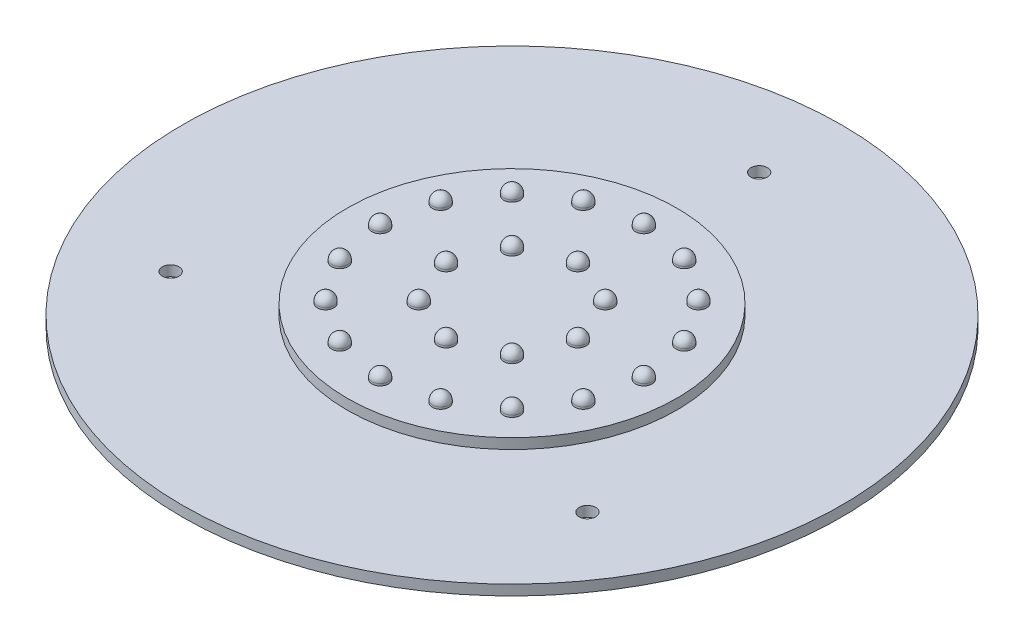
ISO-10303-21;
HEADER;
FILE_DESCRIPTION(('STEP AP214'),'2;1');
FILE_NAME('part.step','',(''),(''),'','','');
FILE_SCHEMA(('AUTOMOTIVE_DESIGN { 1 0 10303 214 1 1 1 1 }'));
ENDSEC;
DATA;
#1=APPLICATION_CONTEXT('core data for automotive mechanical design processes');
#2=APPLICATION_PROTOCOL_DEFINITION('international standard','automotive_design',2000,#1);
#3=PRODUCT_CONTEXT('',#1,'mechanical');
#4=PRODUCT('Part','Part','',(#3));
#5=PRODUCT_RELATED_PRODUCT_CATEGORY('part','',(#4));
#6=PRODUCT_DEFINITION_FORMATION('','',#4);
#7=PRODUCT_DEFINITION_CONTEXT('part definition',#1,'design');
#8=PRODUCT_DEFINITION('design','',#6,#7);
#9=PRODUCT_DEFINITION_SHAPE('','',#8);
#10=(LENGTH_UNIT() NAMED_UNIT(*) SI_UNIT(.MILLI.,.METRE.));
#11=(NAMED_UNIT(*) PLANE_ANGLE_UNIT() SI_UNIT($,.RADIAN.));
#12=(NAMED_UNIT(*) SI_UNIT($,.STERADIAN.) SOLID_ANGLE_UNIT());
#13=UNCERTAINTY_MEASURE_WITH_UNIT(LENGTH_MEASURE(1.E-05),#10,'distance_accuracy_value','');
#14=(GEOMETRIC_REPRESENTATION_CONTEXT(3) GLOBAL_UNCERTAINTY_ASSIGNED_CONTEXT((#13)) GLOBAL_UNIT_ASSIGNED_CONTEXT((#10,
#11,#12)) REPRESENTATION_CONTEXT('',''));
#15=CARTESIAN_POINT('',(0.,0.,0.));
#16=DIRECTION('',(0.,0.,1.));
#17=DIRECTION('',(1.,0.,0.));
#18=AXIS2_PLACEMENT_3D('',#15,#16,#17);
#19=CARTESIAN_POINT('',(0.,5.,0.));
#20=DIRECTION('',(0.,-1.,0.));
#21=DIRECTION('',(0.,0.,-1.));
#22=AXIS2_PLACEMENT_3D('',#19,#20,#21);
#23=CYLINDRICAL_SURFACE('',#22,80.);
#24=CARTESIAN_POINT('',(0.,5.,0.));
#25=DIRECTION('',(0.,1.,0.));
#26=DIRECTION('',(0.,0.,1.));
#27=AXIS2_PLACEMENT_3D('',#24,#25,#26);
#28=CIRCLE('',#27,80.);
#29=CARTESIAN_POINT('',(0.,5.,80.));
#30=VERTEX_POINT('',#29);
#31=EDGE_CURVE('E116',#30,#30,#28,.T.);
#32=ORIENTED_EDGE('',*,*,#31,.F.);
#33=EDGE_LOOP('',(#32));
#34=FACE_BOUND('',#33,.T.);
#35=CARTESIAN_POINT('',(0.,0.,0.));
#36=DIRECTION('',(0.,1.,0.));
#37=DIRECTION('',(0.,0.,1.));
#38=AXIS2_PLACEMENT_3D('',#35,#36,#37);
#39=CIRCLE('',#38,80.);
#40=CARTESIAN_POINT('',(0.,0.,80.));
#41=VERTEX_POINT('',#40);
#42=EDGE_CURVE('E117',#41,#41,#39,.T.);
#43=ORIENTED_EDGE('',*,*,#42,.T.);
#44=EDGE_LOOP('',(#43));
#45=FACE_BOUND('',#44,.T.);
#46=ADVANCED_FACE('F36',(#34,#45),#23,.T.);
#47=CARTESIAN_POINT('',(0.,5.,0.));
#48=DIRECTION('',(0.,1.,0.));
#49=DIRECTION('',(0.,0.,1.));
#50=AXIS2_PLACEMENT_3D('',#47,#48,#49);
#51=PLANE('',#50);
#52=CARTESIAN_POINT('',(-22.6274169979687,5.,-22.6274169979676));
#53=DIRECTION('',(0.,1.,0.));
#54=DIRECTION('',(0.,0.,1.));
#55=AXIS2_PLACEMENT_3D('',#52,#53,#54);
#56=CIRCLE('',#55,4.00000000000171);
#57=CARTESIAN_POINT('',(-22.6274169979687,5.,-18.6274169979659));
#58=VERTEX_POINT('',#57);
#59=EDGE_CURVE('E215',#58,#58,#56,.T.);
#60=ORIENTED_EDGE('',*,*,#59,.F.);
#61=EDGE_LOOP('',(#60));
#62=FACE_BOUND('',#61,.T.);
#63=CARTESIAN_POINT('',(-31.9999999999973,5.,2.72652467044015E-12));
#64=DIRECTION('',(0.,1.,0.));
#65=DIRECTION('',(0.,0.,1.));
#66=AXIS2_PLACEMENT_3D('',#63,#64,#65);
#67=CIRCLE('',#66,4.00000000000372);
#68=CARTESIAN_POINT('',(-31.9999999999973,5.,4.00000000000645));
#69=VERTEX_POINT('',#68);
#70=EDGE_CURVE('E212',#69,#69,#67,.T.);
#71=ORIENTED_EDGE('',*,*,#70,.F.);
#72=EDGE_LOOP('',(#71));
#73=FACE_BOUND('',#72,.T.);
#74=CARTESIAN_POINT('',(-22.6274169979649,5.,22.6274169979714));
#75=DIRECTION('',(0.,1.,0.));
#76=DIRECTION('',(0.,0.,1.));
#77=AXIS2_PLACEMENT_3D('',#74,#75,#76);
#78=CIRCLE('',#77,4.00000000000528);
#79=CARTESIAN_POINT('',(-22.6274169979649,5.,26.6274169979767));
#80=VERTEX_POINT('',#79);
#81=EDGE_CURVE('E209',#80,#80,#78,.T.);
#82=ORIENTED_EDGE('',*,*,#81,.F.);
#83=EDGE_LOOP('',(#82));
#84=FACE_BOUND('',#83,.T.);
#85=CARTESIAN_POINT('',(5.44521160136576E-12,5.,32.));
#86=DIRECTION('',(0.,1.,0.));
#87=DIRECTION('',(0.,0.,1.));
#88=AXIS2_PLACEMENT_3D('',#85,#86,#87);
#89=CIRCLE('',#88,4.00000000000542);
#90=CARTESIAN_POINT('',(5.44521160136576E-12,5.,36.0000000000054));
#91=VERTEX_POINT('',#90);
#92=EDGE_CURVE('E206',#91,#91,#89,.T.);
#93=ORIENTED_EDGE('',*,*,#92,.F.);
#94=EDGE_LOOP('',(#93));
#95=FACE_BOUND('',#94,.T.);
#96=CARTESIAN_POINT('',(22.6274169979742,5.,22.6274169979676));
#97=DIRECTION('',(0.,1.,0.));
#98=DIRECTION('',(0.,0.,1.));
#99=AXIS2_PLACEMENT_3D('',#96,#97,#98);
#100=CIRCLE('',#99,4.00000000000404);
#101=CARTESIAN_POINT('',(22.6274169979742,5.,26.6274169979716));
#102=VERTEX_POINT('',#101);
#103=EDGE_CURVE('E203',#102,#102,#100,.T.);
#104=ORIENTED_EDGE('',*,*,#103,.F.);
#105=EDGE_LOOP('',(#104));
#106=FACE_BOUND('',#105,.T.);
#107=CARTESIAN_POINT('',(32.0000000000027,5.,-2.72260580068288E-12));
#108=DIRECTION('',(0.,1.,0.));
#109=DIRECTION('',(0.,0.,1.));
#110=AXIS2_PLACEMENT_3D('',#107,#108,#109);
#111=CIRCLE('',#110,4.00000000000192);
#112=CARTESIAN_POINT('',(32.0000000000027,5.,3.99999999999919));
#113=VERTEX_POINT('',#112);
#114=EDGE_CURVE('E200',#113,#113,#111,.T.);
#115=ORIENTED_EDGE('',*,*,#114,.F.);
#116=EDGE_LOOP('',(#115));
#117=FACE_BOUND('',#116,.T.);
#118=CARTESIAN_POINT('',(22.6274169979703,5.,-22.6274169979714));
#119=DIRECTION('',(0.,1.,0.));
#120=DIRECTION('',(0.,0.,1.));
#121=AXIS2_PLACEMENT_3D('',#118,#119,#120);
#122=CIRCLE('',#121,4.00000000000026);
#123=CARTESIAN_POINT('',(22.6274169979703,5.,-18.6274169979712));
#124=VERTEX_POINT('',#123);
#125=EDGE_CURVE('E197',#124,#124,#122,.T.);
#126=ORIENTED_EDGE('',*,*,#125,.F.);
#127=EDGE_LOOP('',(#126));
#128=FACE_BOUND('',#127,.T.);
#129=CARTESIAN_POINT('',(0.,5.,-32.));
#130=DIRECTION('',(0.,1.,0.));
#131=DIRECTION('',(0.,0.,1.));
#132=AXIS2_PLACEMENT_3D('',#129,#130,#131);
#133=CIRCLE('',#132,4.);
#134=CARTESIAN_POINT('',(0.,5.,-28.));
#135=VERTEX_POINT('',#134);
#136=EDGE_CURVE('E194',#135,#135,#133,.T.);
#137=ORIENTED_EDGE('',*,*,#136,.F.);
#138=EDGE_LOOP('',(#137));
#139=FACE_BOUND('',#138,.T.);
#140=CARTESIAN_POINT('',(-24.4917396713648,5.,-59.1282900807175));
#141=DIRECTION('',(0.,1.,0.));
#142=DIRECTION('',(0.,0.,1.));
#143=AXIS2_PLACEMENT_3D('',#140,#141,#142);
#144=CIRCLE('',#143,4.00000000000322);
#145=CARTESIAN_POINT('',(-24.4917396713648,5.,-55.1282900807143));
#146=VERTEX_POINT('',#145);
#147=EDGE_CURVE('E191',#146,#146,#144,.T.);
#148=ORIENTED_EDGE('',*,*,#147,.F.);
#149=EDGE_LOOP('',(#148));
#150=FACE_BOUND('',#149,.T.);
#151=CARTESIAN_POINT('',(-45.2548339959353,5.,-45.25483399593));
#152=DIRECTION('',(0.,1.,0.));
#153=DIRECTION('',(0.,0.,1.));
#154=AXIS2_PLACEMENT_3D('',#151,#152,#153);
#155=CIRCLE('',#154,4.00000000000695);
#156=CARTESIAN_POINT('',(-45.2548339959353,5.,-41.2548339959231));
#157=VERTEX_POINT('',#156);
#158=EDGE_CURVE('E188',#157,#157,#155,.T.);
#159=ORIENTED_EDGE('',*,*,#158,.F.);
#160=EDGE_LOOP('',(#159));
#161=FACE_BOUND('',#160,.T.);
#162=CARTESIAN_POINT('',(-59.1282900807145,5.,-24.491739671354));
#163=DIRECTION('',(0.,1.,0.));
#164=DIRECTION('',(0.,0.,1.));
#165=AXIS2_PLACEMENT_3D('',#162,#163,#164);
#166=CIRCLE('',#165,4.00000000001159);
#167=CARTESIAN_POINT('',(-59.1282900807145,5.,-20.4917396713424));
#168=VERTEX_POINT('',#167);
#169=EDGE_CURVE('E185',#168,#168,#166,.T.);
#170=ORIENTED_EDGE('',*,*,#169,.F.);
#171=EDGE_LOOP('',(#170));
#172=FACE_BOUND('',#171,.T.);
#173=CARTESIAN_POINT('',(-63.9999999999873,5.,1.27290069550637E-11));
#174=DIRECTION('',(0.,1.,0.));
#175=DIRECTION('',(0.,0.,1.));
#176=AXIS2_PLACEMENT_3D('',#173,#174,#175);
#177=CIRCLE('',#176,4.00000000001653);
#178=CARTESIAN_POINT('',(-63.9999999999873,5.,4.00000000002926));
#179=VERTEX_POINT('',#178);
#180=EDGE_CURVE('E182',#179,#179,#177,.T.);
#181=ORIENTED_EDGE('',*,*,#180,.F.);
#182=EDGE_LOOP('',(#181));
#183=FACE_BOUND('',#182,.T.);
#184=CARTESIAN_POINT('',(-59.1282900807048,5.,24.4917396713775));
#185=DIRECTION('',(0.,1.,0.));
#186=DIRECTION('',(0.,0.,1.));
#187=AXIS2_PLACEMENT_3D('',#184,#185,#186);
#188=CIRCLE('',#187,4.0000000000209);
#189=CARTESIAN_POINT('',(-59.1282900807048,5.,28.4917396713984));
#190=VERTEX_POINT('',#189);
#191=EDGE_CURVE('E179',#190,#190,#188,.T.);
#192=ORIENTED_EDGE('',*,*,#191,.F.);
#193=EDGE_LOOP('',(#192));
#194=FACE_BOUND('',#193,.T.);
#195=CARTESIAN_POINT('',(-45.2548339959173,5.,45.254833995948));
#196=DIRECTION('',(0.,1.,0.));
#197=DIRECTION('',(0.,0.,1.));
#198=AXIS2_PLACEMENT_3D('',#195,#196,#197);
#199=CIRCLE('',#198,4.00000000002394);
#200=CARTESIAN_POINT('',(-45.2548339959173,5.,49.254833995972));
#201=VERTEX_POINT('',#200);
#202=EDGE_CURVE('E176',#201,#201,#199,.T.);
#203=ORIENTED_EDGE('',*,*,#202,.F.);
#204=EDGE_LOOP('',(#203));
#205=FACE_BOUND('',#204,.T.);
#206=CARTESIAN_POINT('',(-24.4917396713413,5.,59.1282900807272));
#207=DIRECTION('',(0.,1.,0.));
#208=DIRECTION('',(0.,0.,1.));
#209=AXIS2_PLACEMENT_3D('',#206,#207,#208);
#210=CIRCLE('',#209,4.00000000002531);
#211=CARTESIAN_POINT('',(-24.4917396713413,5.,63.1282900807525));
#212=VERTEX_POINT('',#211);
#213=EDGE_CURVE('E173',#212,#212,#210,.T.);
#214=ORIENTED_EDGE('',*,*,#213,.F.);
#215=EDGE_LOOP('',(#214));
#216=FACE_BOUND('',#215,.T.);
#217=CARTESIAN_POINT('',(2.54423384310984E-11,5.,64.));
#218=DIRECTION('',(0.,1.,0.));
#219=DIRECTION('',(0.,0.,1.));
#220=AXIS2_PLACEMENT_3D('',#217,#218,#219);
#221=CIRCLE('',#220,4.00000000002476);
#222=CARTESIAN_POINT('',(2.54423384310984E-11,5.,68.0000000000248));
#223=VERTEX_POINT('',#222);
#224=EDGE_CURVE('E170',#223,#223,#221,.T.);
#225=ORIENTED_EDGE('',*,*,#224,.F.);
#226=EDGE_LOOP('',(#225));
#227=FACE_BOUND('',#226,.T.);
#228=CARTESIAN_POINT('',(24.4917396713902,5.,59.1282900807175));
#229=DIRECTION('',(0.,1.,0.));
#230=DIRECTION('',(0.,0.,1.));
#231=AXIS2_PLACEMENT_3D('',#228,#229,#230);
#232=CIRCLE('',#231,4.00000000002236);
#233=CARTESIAN_POINT('',(24.4917396713902,5.,63.1282900807399));
#234=VERTEX_POINT('',#233);
#235=EDGE_CURVE('E167',#234,#234,#232,.T.);
#236=ORIENTED_EDGE('',*,*,#235,.F.);
#237=EDGE_LOOP('',(#236));
#238=FACE_BOUND('',#237,.T.);
#239=CARTESIAN_POINT('',(45.2548339959608,5.,45.25483399593));
#240=DIRECTION('',(0.,1.,0.));
#241=DIRECTION('',(0.,0.,1.));
#242=AXIS2_PLACEMENT_3D('',#239,#240,#241);
#243=CIRCLE('',#242,4.00000000001846);
#244=CARTESIAN_POINT('',(45.2548339959608,5.,49.2548339959485));
#245=VERTEX_POINT('',#244);
#246=EDGE_CURVE('E164',#245,#245,#243,.T.);
#247=ORIENTED_EDGE('',*,*,#246,.F.);
#248=EDGE_LOOP('',(#247));
#249=FACE_BOUND('',#248,.T.);
#250=CARTESIAN_POINT('',(59.1282900807399,5.,24.491739671354));
#251=DIRECTION('',(0.,1.,0.));
#252=DIRECTION('',(0.,0.,1.));
#253=AXIS2_PLACEMENT_3D('',#250,#251,#252);
#254=CIRCLE('',#253,4.00000000001366);
#255=CARTESIAN_POINT('',(59.1282900807399,5.,28.4917396713677));
#256=VERTEX_POINT('',#255);
#257=EDGE_CURVE('E161',#256,#256,#254,.T.);
#258=ORIENTED_EDGE('',*,*,#257,.F.);
#259=EDGE_LOOP('',(#258));
#260=FACE_BOUND('',#259,.T.);
#261=CARTESIAN_POINT('',(64.0000000000127,5.,-1.27211692155492E-11));
#262=DIRECTION('',(0.,1.,0.));
#263=DIRECTION('',(0.,0.,1.));
#264=AXIS2_PLACEMENT_3D('',#261,#262,#263);
#265=CIRCLE('',#264,4.00000000000866);
#266=CARTESIAN_POINT('',(64.0000000000127,5.,3.99999999999594));
#267=VERTEX_POINT('',#266);
#268=EDGE_CURVE('E158',#267,#267,#265,.T.);
#269=ORIENTED_EDGE('',*,*,#268,.F.);
#270=EDGE_LOOP('',(#269));
#271=FACE_BOUND('',#270,.T.);
#272=CARTESIAN_POINT('',(59.1282900807302,5.,-24.4917396713775));
#273=DIRECTION('',(0.,1.,0.));
#274=DIRECTION('',(0.,0.,1.));
#275=AXIS2_PLACEMENT_3D('',#272,#273,#274);
#276=CIRCLE('',#275,4.00000000000423);
#277=CARTESIAN_POINT('',(59.1282900807302,5.,-20.4917396713733));
#278=VERTEX_POINT('',#277);
#279=EDGE_CURVE('E155',#278,#278,#276,.T.);
#280=ORIENTED_EDGE('',*,*,#279,.F.);
#281=EDGE_LOOP('',(#280));
#282=FACE_BOUND('',#281,.T.);
#283=CARTESIAN_POINT('',(45.2548339959428,5.,-45.254833995948));
#284=DIRECTION('',(0.,1.,0.));
#285=DIRECTION('',(0.,0.,1.));
#286=AXIS2_PLACEMENT_3D('',#283,#284,#285);
#287=CIRCLE('',#286,4.00000000000105);
#288=CARTESIAN_POINT('',(45.2548339959428,5.,-41.254833995947));
#289=VERTEX_POINT('',#288);
#290=EDGE_CURVE('E152',#289,#289,#287,.T.);
#291=ORIENTED_EDGE('',*,*,#290,.F.);
#292=EDGE_LOOP('',(#291));
#293=FACE_BOUND('',#292,.T.);
#294=CARTESIAN_POINT('',(24.4917396713667,5.,-59.1282900807272));
#295=DIRECTION('',(0.,1.,0.));
#296=DIRECTION('',(0.,0.,1.));
#297=AXIS2_PLACEMENT_3D('',#294,#295,#296);
#298=CIRCLE('',#297,3.99999999999958);
#299=CARTESIAN_POINT('',(24.4917396713667,5.,-55.1282900807277));
#300=VERTEX_POINT('',#299);
#301=EDGE_CURVE('E149',#300,#300,#298,.T.);
#302=ORIENTED_EDGE('',*,*,#301,.F.);
#303=EDGE_LOOP('',(#302));
#304=FACE_BOUND('',#303,.T.);
#305=CARTESIAN_POINT('',(0.,5.,-64.));
#306=DIRECTION('',(0.,1.,0.));
#307=DIRECTION('',(0.,0.,1.));
#308=AXIS2_PLACEMENT_3D('',#305,#306,#307);
#309=CIRCLE('',#308,4.);
#310=CARTESIAN_POINT('',(0.,5.,-60.));
#311=VERTEX_POINT('',#310);
#312=EDGE_CURVE('E146',#311,#311,#309,.T.);
#313=ORIENTED_EDGE('',*,*,#312,.F.);
#314=EDGE_LOOP('',(#313));
#315=FACE_BOUND('',#314,.T.);
#316=ORIENTED_EDGE('',*,*,#31,.T.);
#317=EDGE_LOOP('',(#316));
#318=FACE_BOUND('',#317,.T.);
#319=ADVANCED_FACE('F221',(#62,#73,#84,#95,#106,#117,#128,#139,#150,#161,#172,#183,#194,#205,
#216,#227,#238,#249,#260,#271,#282,#293,#304,#315,#318),#51,.T.);
#320=CARTESIAN_POINT('',(0.,-5.,0.));
#321=DIRECTION('',(0.,1.,0.));
#322=DIRECTION('',(0.,0.,1.));
#323=AXIS2_PLACEMENT_3D('',#320,#321,#322);
#324=CYLINDRICAL_SURFACE('',#323,160.);
#325=CARTESIAN_POINT('',(0.,-5.,0.));
#326=DIRECTION('',(0.,1.,0.));
#327=DIRECTION('',(0.,0.,1.));
#328=AXIS2_PLACEMENT_3D('',#325,#326,#327);
#329=CIRCLE('',#328,160.);
#330=CARTESIAN_POINT('',(0.,-5.,160.));
#331=VERTEX_POINT('',#330);
#332=EDGE_CURVE('E120',#331,#331,#329,.T.);
#333=ORIENTED_EDGE('',*,*,#332,.T.);
#334=EDGE_LOOP('',(#333));
#335=FACE_BOUND('',#334,.T.);
#336=CARTESIAN_POINT('',(0.,0.,0.));
#337=DIRECTION('',(0.,1.,0.));
#338=DIRECTION('',(0.,0.,1.));
#339=AXIS2_PLACEMENT_3D('',#336,#337,#338);
#340=CIRCLE('',#339,160.);
#341=CARTESIAN_POINT('',(0.,0.,160.));
#342=VERTEX_POINT('',#341);
#343=EDGE_CURVE('E123',#342,#342,#340,.T.);
#344=ORIENTED_EDGE('',*,*,#343,.F.);
#345=EDGE_LOOP('',(#344));
#346=FACE_BOUND('',#345,.T.);
#347=ADVANCED_FACE('F224',(#335,#346),#324,.T.);
#348=CARTESIAN_POINT('',(0.,-5.,0.));
#349=DIRECTION('',(0.,1.,0.));
#350=DIRECTION('',(0.,0.,1.));
#351=AXIS2_PLACEMENT_3D('',#348,#349,#350);
#352=PLANE('',#351);
#353=CARTESIAN_POINT('',(0.,-5.,-120.));
#354=DIRECTION('',(0.,1.,0.));
#355=DIRECTION('',(0.,0.,1.));
#356=AXIS2_PLACEMENT_3D('',#353,#354,#355);
#357=CIRCLE('',#356,4.);
#358=CARTESIAN_POINT('',(0.,-5.,-116.));
#359=VERTEX_POINT('',#358);
#360=EDGE_CURVE('E140',#359,#359,#357,.T.);
#361=ORIENTED_EDGE('',*,*,#360,.T.);
#362=EDGE_LOOP('',(#361));
#363=FACE_BOUND('',#362,.T.);
#364=CARTESIAN_POINT('',(-101.159490624015,-5.,64.5504256894542));
#365=DIRECTION('',(0.,1.,0.));
#366=DIRECTION('',(0.,0.,1.));
#367=AXIS2_PLACEMENT_3D('',#364,#365,#366);
#368=CIRCLE('',#367,4.);
#369=CARTESIAN_POINT('',(-101.159490624015,-5.,68.5504256894542));
#370=VERTEX_POINT('',#369);
#371=EDGE_CURVE('E134',#370,#370,#368,.T.);
#372=ORIENTED_EDGE('',*,*,#371,.T.);
#373=EDGE_LOOP('',(#372));
#374=FACE_BOUND('',#373,.T.);
#375=CARTESIAN_POINT('',(101.159490624015,-5.,64.5504256894542));
#376=DIRECTION('',(0.,1.,0.));
#377=DIRECTION('',(0.,0.,1.));
#378=AXIS2_PLACEMENT_3D('',#375,#376,#377);
#379=CIRCLE('',#378,4.);
#380=CARTESIAN_POINT('',(101.159490624015,-5.,68.5504256894542));
#381=VERTEX_POINT('',#380);
#382=EDGE_CURVE('E126',#381,#381,#379,.T.);
#383=ORIENTED_EDGE('',*,*,#382,.T.);
#384=EDGE_LOOP('',(#383));
#385=FACE_BOUND('',#384,.T.);
#386=ORIENTED_EDGE('',*,*,#332,.F.);
#387=EDGE_LOOP('',(#386));
#388=FACE_BOUND('',#387,.T.);
#389=ADVANCED_FACE('F283',(#363,#374,#385,#388),#352,.F.);
#390=CARTESIAN_POINT('',(0.,0.,0.));
#391=DIRECTION('',(0.,1.,0.));
#392=DIRECTION('',(0.,0.,1.));
#393=AXIS2_PLACEMENT_3D('',#390,#391,#392);
#394=PLANE('',#393);
#395=CARTESIAN_POINT('',(0.,0.,-120.));
#396=DIRECTION('',(0.,1.,0.));
#397=DIRECTION('',(0.,0.,1.));
#398=AXIS2_PLACEMENT_3D('',#395,#396,#397);
#399=CIRCLE('',#398,4.);
#400=CARTESIAN_POINT('',(0.,0.,-116.));
#401=VERTEX_POINT('',#400);
#402=EDGE_CURVE('E143',#401,#401,#399,.T.);
#403=ORIENTED_EDGE('',*,*,#402,.F.);
#404=EDGE_LOOP('',(#403));
#405=FACE_BOUND('',#404,.T.);
#406=CARTESIAN_POINT('',(-101.159490624015,0.,64.5504256894542));
#407=DIRECTION('',(0.,1.,0.));
#408=DIRECTION('',(0.,0.,1.));
#409=AXIS2_PLACEMENT_3D('',#406,#407,#408);
#410=CIRCLE('',#409,4.);
#411=CARTESIAN_POINT('',(-101.159490624015,0.,68.5504256894542));
#412=VERTEX_POINT('',#411);
#413=EDGE_CURVE('E137',#412,#412,#410,.T.);
#414=ORIENTED_EDGE('',*,*,#413,.F.);
#415=EDGE_LOOP('',(#414));
#416=FACE_BOUND('',#415,.T.);
#417=CARTESIAN_POINT('',(101.159490624015,0.,64.5504256894542));
#418=DIRECTION('',(0.,1.,0.));
#419=DIRECTION('',(0.,0.,1.));
#420=AXIS2_PLACEMENT_3D('',#417,#418,#419);
#421=CIRCLE('',#420,4.);
#422=CARTESIAN_POINT('',(101.159490624015,0.,68.5504256894542));
#423=VERTEX_POINT('',#422);
#424=EDGE_CURVE('E131',#423,#423,#421,.T.);
#425=ORIENTED_EDGE('',*,*,#424,.F.);
#426=EDGE_LOOP('',(#425));
#427=FACE_BOUND('',#426,.T.);
#428=ORIENTED_EDGE('',*,*,#42,.F.);
#429=EDGE_LOOP('',(#428));
#430=FACE_BOUND('',#429,.T.);
#431=ORIENTED_EDGE('',*,*,#343,.T.);
#432=EDGE_LOOP('',(#431));
#433=FACE_BOUND('',#432,.T.);
#434=ADVANCED_FACE('F279',(#405,#416,#427,#430,#433),#394,.T.);
#435=CARTESIAN_POINT('',(101.159490624015,0.,64.5504256894542));
#436=DIRECTION('',(0.,1.,0.));
#437=DIRECTION('',(0.,0.,1.));
#438=AXIS2_PLACEMENT_3D('',#435,#436,#437);
#439=CYLINDRICAL_SURFACE('',#438,4.);
#440=ORIENTED_EDGE('',*,*,#424,.T.);
#441=EDGE_LOOP('',(#440));
#442=FACE_BOUND('',#441,.T.);
#443=ORIENTED_EDGE('',*,*,#382,.F.);
#444=EDGE_LOOP('',(#443));
#445=FACE_BOUND('',#444,.T.);
#446=ADVANCED_FACE('F282',(#442,#445),#439,.F.);
#447=CARTESIAN_POINT('',(-101.159490624015,0.,64.5504256894542));
#448=DIRECTION('',(0.,1.,0.));
#449=DIRECTION('',(0.,0.,1.));
#450=AXIS2_PLACEMENT_3D('',#447,#448,#449);
#451=CYLINDRICAL_SURFACE('',#450,4.);
#452=ORIENTED_EDGE('',*,*,#413,.T.);
#453=EDGE_LOOP('',(#452));
#454=FACE_BOUND('',#453,.T.);
#455=ORIENTED_EDGE('',*,*,#371,.F.);
#456=EDGE_LOOP('',(#455));
#457=FACE_BOUND('',#456,.T.);
#458=ADVANCED_FACE('F777',(#454,#457),#451,.F.);
#459=CARTESIAN_POINT('',(0.,0.,-120.));
#460=DIRECTION('',(0.,1.,0.));
#461=DIRECTION('',(0.,0.,1.));
#462=AXIS2_PLACEMENT_3D('',#459,#460,#461);
#463=CYLINDRICAL_SURFACE('',#462,4.);
#464=ORIENTED_EDGE('',*,*,#402,.T.);
#465=EDGE_LOOP('',(#464));
#466=FACE_BOUND('',#465,.T.);
#467=ORIENTED_EDGE('',*,*,#360,.F.);
#468=EDGE_LOOP('',(#467));
#469=FACE_BOUND('',#468,.T.);
#470=ADVANCED_FACE('F767',(#466,#469),#463,.F.);
#471=CARTESIAN_POINT('',(0.,10.,-64.));
#472=DIRECTION('',(0.,-1.,0.));
#473=DIRECTION('',(0.,0.,-1.));
#474=AXIS2_PLACEMENT_3D('',#471,#472,#473);
#475=CYLINDRICAL_SURFACE('',#474,4.);
#476=CARTESIAN_POINT('',(0.,6.,-64.));
#477=DIRECTION('',(0.,-1.,0.));
#478=DIRECTION('',(0.,0.,-1.));
#479=AXIS2_PLACEMENT_3D('',#476,#477,#478);
#480=CIRCLE('',#479,4.);
#481=CARTESIAN_POINT('',(0.,6.,-68.));
#482=VERTEX_POINT('',#481);
#483=EDGE_CURVE('E71',#482,#482,#480,.T.);
#484=ORIENTED_EDGE('',*,*,#483,.T.);
#485=EDGE_LOOP('',(#484));
#486=FACE_BOUND('',#485,.T.);
#487=ORIENTED_EDGE('',*,*,#312,.T.);
#488=EDGE_LOOP('',(#487));
#489=FACE_BOUND('',#488,.T.);
#490=ADVANCED_FACE('F757',(#486,#489),#475,.T.);
#491=CARTESIAN_POINT('',(24.4917396713667,10.,-59.1282900807272));
#492=DIRECTION('',(0.,-1.,0.));
#493=DIRECTION('',(0.,0.,-1.));
#494=AXIS2_PLACEMENT_3D('',#491,#492,#493);
#495=CYLINDRICAL_SURFACE('',#494,3.99999999999958);
#496=CARTESIAN_POINT('',(24.4917396713667,6.,-59.1282900807272));
#497=DIRECTION('',(0.,-1.,0.));
#498=DIRECTION('',(0.,0.,-1.));
#499=AXIS2_PLACEMENT_3D('',#496,#497,#498);
#500=CIRCLE('',#499,3.99999999999958);
#501=CARTESIAN_POINT('',(24.4917396713667,6.,-63.1282900807268));
#502=VERTEX_POINT('',#501);
#503=EDGE_CURVE('E68',#502,#502,#500,.T.);
#504=ORIENTED_EDGE('',*,*,#503,.T.);
#505=EDGE_LOOP('',(#504));
#506=FACE_BOUND('',#505,.T.);
#507=ORIENTED_EDGE('',*,*,#301,.T.);
#508=EDGE_LOOP('',(#507));
#509=FACE_BOUND('',#508,.T.);
#510=ADVANCED_FACE('F747',(#506,#509),#495,.T.);
#511=CARTESIAN_POINT('',(45.2548339959428,10.,-45.254833995948));
#512=DIRECTION('',(0.,-1.,0.));
#513=DIRECTION('',(0.,0.,-1.));
#514=AXIS2_PLACEMENT_3D('',#511,#512,#513);
#515=CYLINDRICAL_SURFACE('',#514,4.00000000000105);
#516=CARTESIAN_POINT('',(45.2548339959428,6.,-45.254833995948));
#517=DIRECTION('',(0.,-1.,0.));
#518=DIRECTION('',(0.,0.,-1.));
#519=AXIS2_PLACEMENT_3D('',#516,#517,#518);
#520=CIRCLE('',#519,4.00000000000105);
#521=CARTESIAN_POINT('',(45.2548339959428,6.,-49.2548339959491));
#522=VERTEX_POINT('',#521);
#523=EDGE_CURVE('E110',#522,#522,#520,.T.);
#524=ORIENTED_EDGE('',*,*,#523,.T.);
#525=EDGE_LOOP('',(#524));
#526=FACE_BOUND('',#525,.T.);
#527=ORIENTED_EDGE('',*,*,#290,.T.);
#528=EDGE_LOOP('',(#527));
#529=FACE_BOUND('',#528,.T.);
#530=ADVANCED_FACE('F737',(#526,#529),#515,.T.);
#531=CARTESIAN_POINT('',(59.1282900807302,10.,-24.4917396713775));
#532=DIRECTION('',(0.,-1.,0.));
#533=DIRECTION('',(0.,0.,-1.));
#534=AXIS2_PLACEMENT_3D('',#531,#532,#533);
#535=CYLINDRICAL_SURFACE('',#534,4.00000000000423);
#536=CARTESIAN_POINT('',(59.1282900807302,6.,-24.4917396713775));
#537=DIRECTION('',(0.,-1.,0.));
#538=DIRECTION('',(0.,0.,-1.));
#539=AXIS2_PLACEMENT_3D('',#536,#537,#538);
#540=CIRCLE('',#539,4.00000000000423);
#541=CARTESIAN_POINT('',(59.1282900807302,6.,-28.4917396713817));
#542=VERTEX_POINT('',#541);
#543=EDGE_CURVE('E113',#542,#542,#540,.T.);
#544=ORIENTED_EDGE('',*,*,#543,.T.);
#545=EDGE_LOOP('',(#544));
#546=FACE_BOUND('',#545,.T.);
#547=ORIENTED_EDGE('',*,*,#279,.T.);
#548=EDGE_LOOP('',(#547));
#549=FACE_BOUND('',#548,.T.);
#550=ADVANCED_FACE('F727',(#546,#549),#535,.T.);
#551=CARTESIAN_POINT('',(64.0000000000127,10.,-1.27211692155492E-11));
#552=DIRECTION('',(0.,-1.,0.));
#553=DIRECTION('',(0.,0.,-1.));
#554=AXIS2_PLACEMENT_3D('',#551,#552,#553);
#555=CYLINDRICAL_SURFACE('',#554,4.00000000000866);
#556=CARTESIAN_POINT('',(64.0000000000127,6.,-1.27211692155492E-11));
#557=DIRECTION('',(0.,-1.,0.));
#558=DIRECTION('',(0.,0.,-1.));
#559=AXIS2_PLACEMENT_3D('',#556,#557,#558);
#560=CIRCLE('',#559,4.00000000000866);
#561=CARTESIAN_POINT('',(64.0000000000127,6.,-4.00000000002138));
#562=VERTEX_POINT('',#561);
#563=EDGE_CURVE('E107',#562,#562,#560,.T.);
#564=ORIENTED_EDGE('',*,*,#563,.T.);
#565=EDGE_LOOP('',(#564));
#566=FACE_BOUND('',#565,.T.);
#567=ORIENTED_EDGE('',*,*,#268,.T.);
#568=EDGE_LOOP('',(#567));
#569=FACE_BOUND('',#568,.T.);
#570=ADVANCED_FACE('F717',(#566,#569),#555,.T.);
#571=CARTESIAN_POINT('',(59.1282900807399,10.,24.491739671354));
#572=DIRECTION('',(0.,-1.,0.));
#573=DIRECTION('',(0.,0.,-1.));
#574=AXIS2_PLACEMENT_3D('',#571,#572,#573);
#575=CYLINDRICAL_SURFACE('',#574,4.00000000001366);
#576=CARTESIAN_POINT('',(59.1282900807399,6.,24.491739671354));
#577=DIRECTION('',(0.,-1.,0.));
#578=DIRECTION('',(0.,0.,-1.));
#579=AXIS2_PLACEMENT_3D('',#576,#577,#578);
#580=CIRCLE('',#579,4.00000000001366);
#581=CARTESIAN_POINT('',(59.1282900807399,6.,20.4917396713403));
#582=VERTEX_POINT('',#581);
#583=EDGE_CURVE('E104',#582,#582,#580,.T.);
#584=ORIENTED_EDGE('',*,*,#583,.T.);
#585=EDGE_LOOP('',(#584));
#586=FACE_BOUND('',#585,.T.);
#587=ORIENTED_EDGE('',*,*,#257,.T.);
#588=EDGE_LOOP('',(#587));
#589=FACE_BOUND('',#588,.T.);
#590=ADVANCED_FACE('F707',(#586,#589),#575,.T.);
#591=CARTESIAN_POINT('',(45.2548339959608,10.,45.25483399593));
#592=DIRECTION('',(0.,-1.,0.));
#593=DIRECTION('',(0.,0.,-1.));
#594=AXIS2_PLACEMENT_3D('',#591,#592,#593);
#595=CYLINDRICAL_SURFACE('',#594,4.00000000001846);
#596=CARTESIAN_POINT('',(45.2548339959608,6.,45.25483399593));
#597=DIRECTION('',(0.,-1.,0.));
#598=DIRECTION('',(0.,0.,-1.));
#599=AXIS2_PLACEMENT_3D('',#596,#597,#598);
#600=CIRCLE('',#599,4.00000000001846);
#601=CARTESIAN_POINT('',(45.2548339959608,6.,41.2548339959116));
#602=VERTEX_POINT('',#601);
#603=EDGE_CURVE('E101',#602,#602,#600,.T.);
#604=ORIENTED_EDGE('',*,*,#603,.T.);
#605=EDGE_LOOP('',(#604));
#606=FACE_BOUND('',#605,.T.);
#607=ORIENTED_EDGE('',*,*,#246,.T.);
#608=EDGE_LOOP('',(#607));
#609=FACE_BOUND('',#608,.T.);
#610=ADVANCED_FACE('F697',(#606,#609),#595,.T.);
#611=CARTESIAN_POINT('',(24.4917396713902,10.,59.1282900807175));
#612=DIRECTION('',(0.,-1.,0.));
#613=DIRECTION('',(0.,0.,-1.));
#614=AXIS2_PLACEMENT_3D('',#611,#612,#613);
#615=CYLINDRICAL_SURFACE('',#614,4.00000000002236);
#616=CARTESIAN_POINT('',(24.4917396713902,6.,59.1282900807175));
#617=DIRECTION('',(0.,-1.,0.));
#618=DIRECTION('',(0.,0.,-1.));
#619=AXIS2_PLACEMENT_3D('',#616,#617,#618);
#620=CIRCLE('',#619,4.00000000002236);
#621=CARTESIAN_POINT('',(24.4917396713902,6.,55.1282900806951));
#622=VERTEX_POINT('',#621);
#623=EDGE_CURVE('E98',#622,#622,#620,.T.);
#624=ORIENTED_EDGE('',*,*,#623,.T.);
#625=EDGE_LOOP('',(#624));
#626=FACE_BOUND('',#625,.T.);
#627=ORIENTED_EDGE('',*,*,#235,.T.);
#628=EDGE_LOOP('',(#627));
#629=FACE_BOUND('',#628,.T.);
#630=ADVANCED_FACE('F687',(#626,#629),#615,.T.);
#631=CARTESIAN_POINT('',(2.54423384310984E-11,10.,64.));
#632=DIRECTION('',(0.,-1.,0.));
#633=DIRECTION('',(0.,0.,-1.));
#634=AXIS2_PLACEMENT_3D('',#631,#632,#633);
#635=CYLINDRICAL_SURFACE('',#634,4.00000000002476);
#636=CARTESIAN_POINT('',(2.54423384310984E-11,6.,64.));
#637=DIRECTION('',(0.,-1.,0.));
#638=DIRECTION('',(0.,0.,-1.));
#639=AXIS2_PLACEMENT_3D('',#636,#637,#638);
#640=CIRCLE('',#639,4.00000000002476);
#641=CARTESIAN_POINT('',(2.54423384310984E-11,6.,59.9999999999752));
#642=VERTEX_POINT('',#641);
#643=EDGE_CURVE('E95',#642,#642,#640,.T.);
#644=ORIENTED_EDGE('',*,*,#643,.T.);
#645=EDGE_LOOP('',(#644));
#646=FACE_BOUND('',#645,.T.);
#647=ORIENTED_EDGE('',*,*,#224,.T.);
#648=EDGE_LOOP('',(#647));
#649=FACE_BOUND('',#648,.T.);
#650=ADVANCED_FACE('F677',(#646,#649),#635,.T.);
#651=CARTESIAN_POINT('',(-24.4917396713413,10.,59.1282900807272));
#652=DIRECTION('',(0.,-1.,0.));
#653=DIRECTION('',(0.,0.,-1.));
#654=AXIS2_PLACEMENT_3D('',#651,#652,#653);
#655=CYLINDRICAL_SURFACE('',#654,4.00000000002531);
#656=CARTESIAN_POINT('',(-24.4917396713413,6.,59.1282900807272));
#657=DIRECTION('',(0.,-1.,0.));
#658=DIRECTION('',(0.,0.,-1.));
#659=AXIS2_PLACEMENT_3D('',#656,#657,#658);
#660=CIRCLE('',#659,4.00000000002531);
#661=CARTESIAN_POINT('',(-24.4917396713413,6.,55.1282900807019));
#662=VERTEX_POINT('',#661);
#663=EDGE_CURVE('E92',#662,#662,#660,.T.);
#664=ORIENTED_EDGE('',*,*,#663,.T.);
#665=EDGE_LOOP('',(#664));
#666=FACE_BOUND('',#665,.T.);
#667=ORIENTED_EDGE('',*,*,#213,.T.);
#668=EDGE_LOOP('',(#667));
#669=FACE_BOUND('',#668,.T.);
#670=ADVANCED_FACE('F667',(#666,#669),#655,.T.);
#671=CARTESIAN_POINT('',(-45.2548339959173,10.,45.254833995948));
#672=DIRECTION('',(0.,-1.,0.));
#673=DIRECTION('',(0.,0.,-1.));
#674=AXIS2_PLACEMENT_3D('',#671,#672,#673);
#675=CYLINDRICAL_SURFACE('',#674,4.00000000002394);
#676=CARTESIAN_POINT('',(-45.2548339959173,6.,45.254833995948));
#677=DIRECTION('',(0.,-1.,0.));
#678=DIRECTION('',(0.,0.,-1.));
#679=AXIS2_PLACEMENT_3D('',#676,#677,#678);
#680=CIRCLE('',#679,4.00000000002394);
#681=CARTESIAN_POINT('',(-45.2548339959173,6.,41.2548339959241));
#682=VERTEX_POINT('',#681);
#683=EDGE_CURVE('E89',#682,#682,#680,.T.);
#684=ORIENTED_EDGE('',*,*,#683,.T.);
#685=EDGE_LOOP('',(#684));
#686=FACE_BOUND('',#685,.T.);
#687=ORIENTED_EDGE('',*,*,#202,.T.);
#688=EDGE_LOOP('',(#687));
#689=FACE_BOUND('',#688,.T.);
#690=ADVANCED_FACE('F657',(#686,#689),#675,.T.);
#691=CARTESIAN_POINT('',(-59.1282900807048,10.,24.4917396713775));
#692=DIRECTION('',(0.,-1.,0.));
#693=DIRECTION('',(0.,0.,-1.));
#694=AXIS2_PLACEMENT_3D('',#691,#692,#693);
#695=CYLINDRICAL_SURFACE('',#694,4.0000000000209);
#696=CARTESIAN_POINT('',(-59.1282900807048,6.,24.4917396713775));
#697=DIRECTION('',(0.,-1.,0.));
#698=DIRECTION('',(0.,0.,-1.));
#699=AXIS2_PLACEMENT_3D('',#696,#697,#698);
#700=CIRCLE('',#699,4.0000000000209);
#701=CARTESIAN_POINT('',(-59.1282900807048,6.,20.4917396713566));
#702=VERTEX_POINT('',#701);
#703=EDGE_CURVE('E86',#702,#702,#700,.T.);
#704=ORIENTED_EDGE('',*,*,#703,.T.);
#705=EDGE_LOOP('',(#704));
#706=FACE_BOUND('',#705,.T.);
#707=ORIENTED_EDGE('',*,*,#191,.T.);
#708=EDGE_LOOP('',(#707));
#709=FACE_BOUND('',#708,.T.);
#710=ADVANCED_FACE('F647',(#706,#709),#695,.T.);
#711=CARTESIAN_POINT('',(-63.9999999999873,10.,1.27290069550637E-11));
#712=DIRECTION('',(0.,-1.,0.));
#713=DIRECTION('',(0.,0.,-1.));
#714=AXIS2_PLACEMENT_3D('',#711,#712,#713);
#715=CYLINDRICAL_SURFACE('',#714,4.00000000001653);
#716=CARTESIAN_POINT('',(-63.9999999999873,6.,1.27290069550637E-11));
#717=DIRECTION('',(0.,-1.,0.));
#718=DIRECTION('',(0.,0.,-1.));
#719=AXIS2_PLACEMENT_3D('',#716,#717,#718);
#720=CIRCLE('',#719,4.00000000001653);
#721=CARTESIAN_POINT('',(-63.9999999999873,6.,-4.0000000000038));
#722=VERTEX_POINT('',#721);
#723=EDGE_CURVE('E83',#722,#722,#720,.T.);
#724=ORIENTED_EDGE('',*,*,#723,.T.);
#725=EDGE_LOOP('',(#724));
#726=FACE_BOUND('',#725,.T.);
#727=ORIENTED_EDGE('',*,*,#180,.T.);
#728=EDGE_LOOP('',(#727));
#729=FACE_BOUND('',#728,.T.);
#730=ADVANCED_FACE('F637',(#726,#729),#715,.T.);
#731=CARTESIAN_POINT('',(-59.1282900807145,10.,-24.491739671354));
#732=DIRECTION('',(0.,-1.,0.));
#733=DIRECTION('',(0.,0.,-1.));
#734=AXIS2_PLACEMENT_3D('',#731,#732,#733);
#735=CYLINDRICAL_SURFACE('',#734,4.00000000001159);
#736=CARTESIAN_POINT('',(-59.1282900807145,6.,-24.491739671354));
#737=DIRECTION('',(0.,-1.,0.));
#738=DIRECTION('',(0.,0.,-1.));
#739=AXIS2_PLACEMENT_3D('',#736,#737,#738);
#740=CIRCLE('',#739,4.00000000001159);
#741=CARTESIAN_POINT('',(-59.1282900807145,6.,-28.4917396713656));
#742=VERTEX_POINT('',#741);
#743=EDGE_CURVE('E80',#742,#742,#740,.T.);
#744=ORIENTED_EDGE('',*,*,#743,.T.);
#745=EDGE_LOOP('',(#744));
#746=FACE_BOUND('',#745,.T.);
#747=ORIENTED_EDGE('',*,*,#169,.T.);
#748=EDGE_LOOP('',(#747));
#749=FACE_BOUND('',#748,.T.);
#750=ADVANCED_FACE('F627',(#746,#749),#735,.T.);
#751=CARTESIAN_POINT('',(-45.2548339959353,10.,-45.25483399593));
#752=DIRECTION('',(0.,-1.,0.));
#753=DIRECTION('',(0.,0.,-1.));
#754=AXIS2_PLACEMENT_3D('',#751,#752,#753);
#755=CYLINDRICAL_SURFACE('',#754,4.00000000000695);
#756=CARTESIAN_POINT('',(-45.2548339959353,6.,-45.25483399593));
#757=DIRECTION('',(0.,-1.,0.));
#758=DIRECTION('',(0.,0.,-1.));
#759=AXIS2_PLACEMENT_3D('',#756,#757,#758);
#760=CIRCLE('',#759,4.00000000000695);
#761=CARTESIAN_POINT('',(-45.2548339959353,6.,-49.254833995937));
#762=VERTEX_POINT('',#761);
#763=EDGE_CURVE('E77',#762,#762,#760,.T.);
#764=ORIENTED_EDGE('',*,*,#763,.T.);
#765=EDGE_LOOP('',(#764));
#766=FACE_BOUND('',#765,.T.);
#767=ORIENTED_EDGE('',*,*,#158,.T.);
#768=EDGE_LOOP('',(#767));
#769=FACE_BOUND('',#768,.T.);
#770=ADVANCED_FACE('F617',(#766,#769),#755,.T.);
#771=CARTESIAN_POINT('',(-24.4917396713648,10.,-59.1282900807175));
#772=DIRECTION('',(0.,-1.,0.));
#773=DIRECTION('',(0.,0.,-1.));
#774=AXIS2_PLACEMENT_3D('',#771,#772,#773);
#775=CYLINDRICAL_SURFACE('',#774,4.00000000000322);
#776=CARTESIAN_POINT('',(-24.4917396713648,6.,-59.1282900807175));
#777=DIRECTION('',(0.,-1.,0.));
#778=DIRECTION('',(0.,0.,-1.));
#779=AXIS2_PLACEMENT_3D('',#776,#777,#778);
#780=CIRCLE('',#779,4.00000000000322);
#781=CARTESIAN_POINT('',(-24.4917396713648,6.,-63.1282900807207));
#782=VERTEX_POINT('',#781);
#783=EDGE_CURVE('E74',#782,#782,#780,.T.);
#784=ORIENTED_EDGE('',*,*,#783,.T.);
#785=EDGE_LOOP('',(#784));
#786=FACE_BOUND('',#785,.T.);
#787=ORIENTED_EDGE('',*,*,#147,.T.);
#788=EDGE_LOOP('',(#787));
#789=FACE_BOUND('',#788,.T.);
#790=ADVANCED_FACE('F301',(#786,#789),#775,.T.);
#791=CARTESIAN_POINT('',(59.1282900807302,6.,-24.4917396713775));
#792=DIRECTION('',(0.,1.,0.));
#793=DIRECTION('',(0.,0.,1.));
#794=AXIS2_PLACEMENT_3D('',#791,#792,#793);
#795=SPHERICAL_SURFACE('',#794,4.);
#796=ORIENTED_EDGE('',*,*,#543,.F.);
#797=EDGE_LOOP('',(#796));
#798=FACE_BOUND('',#797,.T.);
#799=ADVANCED_FACE('F297',(#798),#795,.T.);
#800=CARTESIAN_POINT('',(45.2548339959428,6.,-45.254833995948));
#801=DIRECTION('',(0.,1.,0.));
#802=DIRECTION('',(0.,0.,1.));
#803=AXIS2_PLACEMENT_3D('',#800,#801,#802);
#804=SPHERICAL_SURFACE('',#803,4.);
#805=ORIENTED_EDGE('',*,*,#523,.F.);
#806=EDGE_LOOP('',(#805));
#807=FACE_BOUND('',#806,.T.);
#808=ADVANCED_FACE('F300',(#807),#804,.T.);
#809=CARTESIAN_POINT('',(64.0000000000127,6.,-1.27211692155492E-11));
#810=DIRECTION('',(0.,1.,0.));
#811=DIRECTION('',(0.,0.,1.));
#812=AXIS2_PLACEMENT_3D('',#809,#810,#811);
#813=SPHERICAL_SURFACE('',#812,4.);
#814=ORIENTED_EDGE('',*,*,#563,.F.);
#815=EDGE_LOOP('',(#814));
#816=FACE_BOUND('',#815,.T.);
#817=ADVANCED_FACE('F305',(#816),#813,.T.);
#818=CARTESIAN_POINT('',(59.1282900807399,6.,24.491739671354));
#819=DIRECTION('',(0.,1.,0.));
#820=DIRECTION('',(0.,0.,1.));
#821=AXIS2_PLACEMENT_3D('',#818,#819,#820);
#822=SPHERICAL_SURFACE('',#821,4.);
#823=ORIENTED_EDGE('',*,*,#583,.F.);
#824=EDGE_LOOP('',(#823));
#825=FACE_BOUND('',#824,.T.);
#826=ADVANCED_FACE('F309',(#825),#822,.T.);
#827=CARTESIAN_POINT('',(45.2548339959608,6.,45.25483399593));
#828=DIRECTION('',(0.,1.,0.));
#829=DIRECTION('',(0.,0.,1.));
#830=AXIS2_PLACEMENT_3D('',#827,#828,#829);
#831=SPHERICAL_SURFACE('',#830,4.);
#832=ORIENTED_EDGE('',*,*,#603,.F.);
#833=EDGE_LOOP('',(#832));
#834=FACE_BOUND('',#833,.T.);
#835=ADVANCED_FACE('F313',(#834),#831,.T.);
#836=CARTESIAN_POINT('',(24.4917396713902,6.,59.1282900807175));
#837=DIRECTION('',(0.,1.,0.));
#838=DIRECTION('',(0.,0.,1.));
#839=AXIS2_PLACEMENT_3D('',#836,#837,#838);
#840=SPHERICAL_SURFACE('',#839,4.);
#841=ORIENTED_EDGE('',*,*,#623,.F.);
#842=EDGE_LOOP('',(#841));
#843=FACE_BOUND('',#842,.T.);
#844=ADVANCED_FACE('F317',(#843),#840,.T.);
#845=CARTESIAN_POINT('',(2.54423384310984E-11,6.,64.));
#846=DIRECTION('',(0.,1.,0.));
#847=DIRECTION('',(0.,0.,1.));
#848=AXIS2_PLACEMENT_3D('',#845,#846,#847);
#849=SPHERICAL_SURFACE('',#848,4.);
#850=ORIENTED_EDGE('',*,*,#643,.F.);
#851=EDGE_LOOP('',(#850));
#852=FACE_BOUND('',#851,.T.);
#853=ADVANCED_FACE('F321',(#852),#849,.T.);
#854=CARTESIAN_POINT('',(-24.4917396713413,6.,59.1282900807272));
#855=DIRECTION('',(0.,1.,0.));
#856=DIRECTION('',(0.,0.,1.));
#857=AXIS2_PLACEMENT_3D('',#854,#855,#856);
#858=SPHERICAL_SURFACE('',#857,4.);
#859=ORIENTED_EDGE('',*,*,#663,.F.);
#860=EDGE_LOOP('',(#859));
#861=FACE_BOUND('',#860,.T.);
#862=ADVANCED_FACE('F325',(#861),#858,.T.);
#863=CARTESIAN_POINT('',(-45.2548339959173,6.,45.254833995948));
#864=DIRECTION('',(0.,1.,0.));
#865=DIRECTION('',(0.,0.,1.));
#866=AXIS2_PLACEMENT_3D('',#863,#864,#865);
#867=SPHERICAL_SURFACE('',#866,4.);
#868=ORIENTED_EDGE('',*,*,#683,.F.);
#869=EDGE_LOOP('',(#868));
#870=FACE_BOUND('',#869,.T.);
#871=ADVANCED_FACE('F329',(#870),#867,.T.);
#872=CARTESIAN_POINT('',(-59.1282900807048,6.,24.4917396713775));
#873=DIRECTION('',(0.,1.,0.));
#874=DIRECTION('',(0.,0.,1.));
#875=AXIS2_PLACEMENT_3D('',#872,#873,#874);
#876=SPHERICAL_SURFACE('',#875,4.);
#877=ORIENTED_EDGE('',*,*,#703,.F.);
#878=EDGE_LOOP('',(#877));
#879=FACE_BOUND('',#878,.T.);
#880=ADVANCED_FACE('F333',(#879),#876,.T.);
#881=CARTESIAN_POINT('',(-63.9999999999873,6.,1.27290069550637E-11));
#882=DIRECTION('',(0.,1.,0.));
#883=DIRECTION('',(0.,0.,1.));
#884=AXIS2_PLACEMENT_3D('',#881,#882,#883);
#885=SPHERICAL_SURFACE('',#884,4.);
#886=ORIENTED_EDGE('',*,*,#723,.F.);
#887=EDGE_LOOP('',(#886));
#888=FACE_BOUND('',#887,.T.);
#889=ADVANCED_FACE('F337',(#888),#885,.T.);
#890=CARTESIAN_POINT('',(-59.1282900807145,6.,-24.491739671354));
#891=DIRECTION('',(0.,1.,0.));
#892=DIRECTION('',(0.,0.,1.));
#893=AXIS2_PLACEMENT_3D('',#890,#891,#892);
#894=SPHERICAL_SURFACE('',#893,4.);
#895=ORIENTED_EDGE('',*,*,#743,.F.);
#896=EDGE_LOOP('',(#895));
#897=FACE_BOUND('',#896,.T.);
#898=ADVANCED_FACE('F341',(#897),#894,.T.);
#899=CARTESIAN_POINT('',(-45.2548339959353,6.,-45.25483399593));
#900=DIRECTION('',(0.,1.,0.));
#901=DIRECTION('',(0.,0.,1.));
#902=AXIS2_PLACEMENT_3D('',#899,#900,#901);
#903=SPHERICAL_SURFACE('',#902,4.);
#904=ORIENTED_EDGE('',*,*,#763,.F.);
#905=EDGE_LOOP('',(#904));
#906=FACE_BOUND('',#905,.T.);
#907=ADVANCED_FACE('F345',(#906),#903,.T.);
#908=CARTESIAN_POINT('',(-24.4917396713648,6.,-59.1282900807175));
#909=DIRECTION('',(0.,1.,0.));
#910=DIRECTION('',(0.,0.,1.));
#911=AXIS2_PLACEMENT_3D('',#908,#909,#910);
#912=SPHERICAL_SURFACE('',#911,4.);
#913=ORIENTED_EDGE('',*,*,#783,.F.);
#914=EDGE_LOOP('',(#913));
#915=FACE_BOUND('',#914,.T.);
#916=ADVANCED_FACE('F349',(#915),#912,.T.);
#917=CARTESIAN_POINT('',(0.,6.,-64.));
#918=DIRECTION('',(0.,1.,0.));
#919=DIRECTION('',(0.,0.,1.));
#920=AXIS2_PLACEMENT_3D('',#917,#918,#919);
#921=SPHERICAL_SURFACE('',#920,4.);
#922=ORIENTED_EDGE('',*,*,#483,.F.);
#923=EDGE_LOOP('',(#922));
#924=FACE_BOUND('',#923,.T.);
#925=ADVANCED_FACE('F353',(#924),#921,.T.);
#926=CARTESIAN_POINT('',(24.4917396713667,6.,-59.1282900807272));
#927=DIRECTION('',(0.,1.,0.));
#928=DIRECTION('',(0.,0.,1.));
#929=AXIS2_PLACEMENT_3D('',#926,#927,#928);
#930=SPHERICAL_SURFACE('',#929,4.);
#931=ORIENTED_EDGE('',*,*,#503,.F.);
#932=EDGE_LOOP('',(#931));
#933=FACE_BOUND('',#932,.T.);
#934=ADVANCED_FACE('F357',(#933),#930,.T.);
#935=CARTESIAN_POINT('',(0.,10.,-32.));
#936=DIRECTION('',(0.,-1.,0.));
#937=DIRECTION('',(0.,0.,-1.));
#938=AXIS2_PLACEMENT_3D('',#935,#936,#937);
#939=CYLINDRICAL_SURFACE('',#938,4.);
#940=CARTESIAN_POINT('',(0.,6.,-32.));
#941=DIRECTION('',(0.,-1.,0.));
#942=DIRECTION('',(0.,0.,-1.));
#943=AXIS2_PLACEMENT_3D('',#940,#941,#942);
#944=CIRCLE('',#943,4.);
#945=CARTESIAN_POINT('',(0.,6.,-36.));
#946=VERTEX_POINT('',#945);
#947=EDGE_CURVE('E10',#946,#946,#944,.T.);
#948=ORIENTED_EDGE('',*,*,#947,.T.);
#949=EDGE_LOOP('',(#948));
#950=FACE_BOUND('',#949,.T.);
#951=ORIENTED_EDGE('',*,*,#136,.T.);
#952=EDGE_LOOP('',(#951));
#953=FACE_BOUND('',#952,.T.);
#954=ADVANCED_FACE('F361',(#950,#953),#939,.T.);
#955=CARTESIAN_POINT('',(22.6274169979703,10.,-22.6274169979714));
#956=DIRECTION('',(0.,-1.,0.));
#957=DIRECTION('',(0.,0.,-1.));
#958=AXIS2_PLACEMENT_3D('',#955,#956,#957);
#959=CYLINDRICAL_SURFACE('',#958,4.00000000000026);
#960=CARTESIAN_POINT('',(22.6274169979703,6.,-22.6274169979714));
#961=DIRECTION('',(0.,-1.,0.));
#962=DIRECTION('',(0.,0.,-1.));
#963=AXIS2_PLACEMENT_3D('',#960,#961,#962);
#964=CIRCLE('',#963,4.00000000000026);
#965=CARTESIAN_POINT('',(22.6274169979703,6.,-26.6274169979717));
#966=VERTEX_POINT('',#965);
#967=EDGE_CURVE('E43',#966,#966,#964,.T.);
#968=ORIENTED_EDGE('',*,*,#967,.T.);
#969=EDGE_LOOP('',(#968));
#970=FACE_BOUND('',#969,.T.);
#971=ORIENTED_EDGE('',*,*,#125,.T.);
#972=EDGE_LOOP('',(#971));
#973=FACE_BOUND('',#972,.T.);
#974=ADVANCED_FACE('F494',(#970,#973),#959,.T.);
#975=CARTESIAN_POINT('',(32.0000000000027,10.,-2.72260580068288E-12));
#976=DIRECTION('',(0.,-1.,0.));
#977=DIRECTION('',(0.,0.,-1.));
#978=AXIS2_PLACEMENT_3D('',#975,#976,#977);
#979=CYLINDRICAL_SURFACE('',#978,4.00000000000192);
#980=CARTESIAN_POINT('',(32.0000000000027,6.,-2.72260580068288E-12));
#981=DIRECTION('',(0.,-1.,0.));
#982=DIRECTION('',(0.,0.,-1.));
#983=AXIS2_PLACEMENT_3D('',#980,#981,#982);
#984=CIRCLE('',#983,4.00000000000192);
#985=CARTESIAN_POINT('',(32.0000000000027,6.,-4.00000000000464));
#986=VERTEX_POINT('',#985);
#987=EDGE_CURVE('E47',#986,#986,#984,.T.);
#988=ORIENTED_EDGE('',*,*,#987,.T.);
#989=EDGE_LOOP('',(#988));
#990=FACE_BOUND('',#989,.T.);
#991=ORIENTED_EDGE('',*,*,#114,.T.);
#992=EDGE_LOOP('',(#991));
#993=FACE_BOUND('',#992,.T.);
#994=ADVANCED_FACE('F484',(#990,#993),#979,.T.);
#995=CARTESIAN_POINT('',(22.6274169979742,10.,22.6274169979676));
#996=DIRECTION('',(0.,-1.,0.));
#997=DIRECTION('',(0.,0.,-1.));
#998=AXIS2_PLACEMENT_3D('',#995,#996,#997);
#999=CYLINDRICAL_SURFACE('',#998,4.00000000000404);
#1000=CARTESIAN_POINT('',(22.6274169979742,6.,22.6274169979676));
#1001=DIRECTION('',(0.,-1.,0.));
#1002=DIRECTION('',(0.,0.,-1.));
#1003=AXIS2_PLACEMENT_3D('',#1000,#1001,#1002);
#1004=CIRCLE('',#1003,4.00000000000404);
#1005=CARTESIAN_POINT('',(22.6274169979742,6.,18.6274169979636));
#1006=VERTEX_POINT('',#1005);
#1007=EDGE_CURVE('E51',#1006,#1006,#1004,.T.);
#1008=ORIENTED_EDGE('',*,*,#1007,.T.);
#1009=EDGE_LOOP('',(#1008));
#1010=FACE_BOUND('',#1009,.T.);
#1011=ORIENTED_EDGE('',*,*,#103,.T.);
#1012=EDGE_LOOP('',(#1011));
#1013=FACE_BOUND('',#1012,.T.);
#1014=ADVANCED_FACE('F474',(#1010,#1013),#999,.T.);
#1015=CARTESIAN_POINT('',(5.44521160136576E-12,10.,32.));
#1016=DIRECTION('',(0.,-1.,0.));
#1017=DIRECTION('',(0.,0.,-1.));
#1018=AXIS2_PLACEMENT_3D('',#1015,#1016,#1017);
#1019=CYLINDRICAL_SURFACE('',#1018,4.00000000000542);
#1020=CARTESIAN_POINT('',(5.44521160136576E-12,6.,32.));
#1021=DIRECTION('',(0.,-1.,0.));
#1022=DIRECTION('',(0.,0.,-1.));
#1023=AXIS2_PLACEMENT_3D('',#1020,#1021,#1022);
#1024=CIRCLE('',#1023,4.00000000000542);
#1025=CARTESIAN_POINT('',(5.44521160136576E-12,6.,27.9999999999946));
#1026=VERTEX_POINT('',#1025);
#1027=EDGE_CURVE('E56',#1026,#1026,#1024,.T.);
#1028=ORIENTED_EDGE('',*,*,#1027,.T.);
#1029=EDGE_LOOP('',(#1028));
#1030=FACE_BOUND('',#1029,.T.);
#1031=ORIENTED_EDGE('',*,*,#92,.T.);
#1032=EDGE_LOOP('',(#1031));
#1033=FACE_BOUND('',#1032,.T.);
#1034=ADVANCED_FACE('F464',(#1030,#1033),#1019,.T.);
#1035=CARTESIAN_POINT('',(-22.6274169979649,10.,22.6274169979714));
#1036=DIRECTION('',(0.,-1.,0.));
#1037=DIRECTION('',(0.,0.,-1.));
#1038=AXIS2_PLACEMENT_3D('',#1035,#1036,#1037);
#1039=CYLINDRICAL_SURFACE('',#1038,4.00000000000528);
#1040=CARTESIAN_POINT('',(-22.6274169979649,6.,22.6274169979714));
#1041=DIRECTION('',(0.,-1.,0.));
#1042=DIRECTION('',(0.,0.,-1.));
#1043=AXIS2_PLACEMENT_3D('',#1040,#1041,#1042);
#1044=CIRCLE('',#1043,4.00000000000528);
#1045=CARTESIAN_POINT('',(-22.6274169979649,6.,18.6274169979662));
#1046=VERTEX_POINT('',#1045);
#1047=EDGE_CURVE('E59',#1046,#1046,#1044,.T.);
#1048=ORIENTED_EDGE('',*,*,#1047,.T.);
#1049=EDGE_LOOP('',(#1048));
#1050=FACE_BOUND('',#1049,.T.);
#1051=ORIENTED_EDGE('',*,*,#81,.T.);
#1052=EDGE_LOOP('',(#1051));
#1053=FACE_BOUND('',#1052,.T.);
#1054=ADVANCED_FACE('F454',(#1050,#1053),#1039,.T.);
#1055=CARTESIAN_POINT('',(-31.9999999999973,10.,2.72652467044015E-12));
#1056=DIRECTION('',(0.,-1.,0.));
#1057=DIRECTION('',(0.,0.,-1.));
#1058=AXIS2_PLACEMENT_3D('',#1055,#1056,#1057);
#1059=CYLINDRICAL_SURFACE('',#1058,4.00000000000372);
#1060=CARTESIAN_POINT('',(-31.9999999999973,6.,2.72652467044015E-12));
#1061=DIRECTION('',(0.,-1.,0.));
#1062=DIRECTION('',(0.,0.,-1.));
#1063=AXIS2_PLACEMENT_3D('',#1060,#1061,#1062);
#1064=CIRCLE('',#1063,4.00000000000372);
#1065=CARTESIAN_POINT('',(-31.9999999999973,6.,-4.000000000001));
#1066=VERTEX_POINT('',#1065);
#1067=EDGE_CURVE('E62',#1066,#1066,#1064,.T.);
#1068=ORIENTED_EDGE('',*,*,#1067,.T.);
#1069=EDGE_LOOP('',(#1068));
#1070=FACE_BOUND('',#1069,.T.);
#1071=ORIENTED_EDGE('',*,*,#70,.T.);
#1072=EDGE_LOOP('',(#1071));
#1073=FACE_BOUND('',#1072,.T.);
#1074=ADVANCED_FACE('F444',(#1070,#1073),#1059,.T.);
#1075=CARTESIAN_POINT('',(-22.6274169979687,10.,-22.6274169979676));
#1076=DIRECTION('',(0.,-1.,0.));
#1077=DIRECTION('',(0.,0.,-1.));
#1078=AXIS2_PLACEMENT_3D('',#1075,#1076,#1077);
#1079=CYLINDRICAL_SURFACE('',#1078,4.00000000000171);
#1080=CARTESIAN_POINT('',(-22.6274169979687,6.,-22.6274169979676));
#1081=DIRECTION('',(0.,-1.,0.));
#1082=DIRECTION('',(0.,0.,-1.));
#1083=AXIS2_PLACEMENT_3D('',#1080,#1081,#1082);
#1084=CIRCLE('',#1083,4.00000000000171);
#1085=CARTESIAN_POINT('',(-22.6274169979687,6.,-26.6274169979693));
#1086=VERTEX_POINT('',#1085);
#1087=EDGE_CURVE('E65',#1086,#1086,#1084,.T.);
#1088=ORIENTED_EDGE('',*,*,#1087,.T.);
#1089=EDGE_LOOP('',(#1088));
#1090=FACE_BOUND('',#1089,.T.);
#1091=ORIENTED_EDGE('',*,*,#59,.T.);
#1092=EDGE_LOOP('',(#1091));
#1093=FACE_BOUND('',#1092,.T.);
#1094=ADVANCED_FACE('F219',(#1090,#1093),#1079,.T.);
#1095=CARTESIAN_POINT('',(-22.6274169979687,6.,-22.6274169979676));
#1096=DIRECTION('',(0.,1.,0.));
#1097=DIRECTION('',(0.,0.,1.));
#1098=AXIS2_PLACEMENT_3D('',#1095,#1096,#1097);
#1099=SPHERICAL_SURFACE('',#1098,4.);
#1100=ORIENTED_EDGE('',*,*,#1087,.F.);
#1101=EDGE_LOOP('',(#1100));
#1102=FACE_BOUND('',#1101,.T.);
#1103=ADVANCED_FACE('F363',(#1102),#1099,.T.);
#1104=CARTESIAN_POINT('',(-31.9999999999973,6.,2.72652467044015E-12));
#1105=DIRECTION('',(0.,1.,0.));
#1106=DIRECTION('',(0.,0.,1.));
#1107=AXIS2_PLACEMENT_3D('',#1104,#1105,#1106);
#1108=SPHERICAL_SURFACE('',#1107,4.);
#1109=ORIENTED_EDGE('',*,*,#1067,.F.);
#1110=EDGE_LOOP('',(#1109));
#1111=FACE_BOUND('',#1110,.T.);
#1112=ADVANCED_FACE('F366',(#1111),#1108,.T.);
#1113=CARTESIAN_POINT('',(-22.6274169979649,6.,22.6274169979714));
#1114=DIRECTION('',(0.,1.,0.));
#1115=DIRECTION('',(0.,0.,1.));
#1116=AXIS2_PLACEMENT_3D('',#1113,#1114,#1115);
#1117=SPHERICAL_SURFACE('',#1116,4.);
#1118=ORIENTED_EDGE('',*,*,#1047,.F.);
#1119=EDGE_LOOP('',(#1118));
#1120=FACE_BOUND('',#1119,.T.);
#1121=ADVANCED_FACE('F370',(#1120),#1117,.T.);
#1122=CARTESIAN_POINT('',(5.44521160136576E-12,6.,32.));
#1123=DIRECTION('',(0.,1.,0.));
#1124=DIRECTION('',(0.,0.,1.));
#1125=AXIS2_PLACEMENT_3D('',#1122,#1123,#1124);
#1126=SPHERICAL_SURFACE('',#1125,4.);
#1127=ORIENTED_EDGE('',*,*,#1027,.F.);
#1128=EDGE_LOOP('',(#1127));
#1129=FACE_BOUND('',#1128,.T.);
#1130=ADVANCED_FACE('F374',(#1129),#1126,.T.);
#1131=CARTESIAN_POINT('',(22.6274169979742,6.,22.6274169979676));
#1132=DIRECTION('',(0.,1.,0.));
#1133=DIRECTION('',(0.,0.,1.));
#1134=AXIS2_PLACEMENT_3D('',#1131,#1132,#1133);
#1135=SPHERICAL_SURFACE('',#1134,4.);
#1136=ORIENTED_EDGE('',*,*,#1007,.F.);
#1137=EDGE_LOOP('',(#1136));
#1138=FACE_BOUND('',#1137,.T.);
#1139=ADVANCED_FACE('F378',(#1138),#1135,.T.);
#1140=CARTESIAN_POINT('',(32.0000000000027,6.,-2.72260580068288E-12));
#1141=DIRECTION('',(0.,1.,0.));
#1142=DIRECTION('',(0.,0.,1.));
#1143=AXIS2_PLACEMENT_3D('',#1140,#1141,#1142);
#1144=SPHERICAL_SURFACE('',#1143,4.);
#1145=ORIENTED_EDGE('',*,*,#987,.F.);
#1146=EDGE_LOOP('',(#1145));
#1147=FACE_BOUND('',#1146,.T.);
#1148=ADVANCED_FACE('F382',(#1147),#1144,.T.);
#1149=CARTESIAN_POINT('',(22.6274169979703,6.,-22.6274169979714));
#1150=DIRECTION('',(0.,1.,0.));
#1151=DIRECTION('',(0.,0.,1.));
#1152=AXIS2_PLACEMENT_3D('',#1149,#1150,#1151);
#1153=SPHERICAL_SURFACE('',#1152,4.);
#1154=ORIENTED_EDGE('',*,*,#967,.F.);
#1155=EDGE_LOOP('',(#1154));
#1156=FACE_BOUND('',#1155,.T.);
#1157=ADVANCED_FACE('F385',(#1156),#1153,.T.);
#1158=CARTESIAN_POINT('',(0.,6.,-32.));
#1159=DIRECTION('',(0.,1.,0.));
#1160=DIRECTION('',(0.,0.,1.));
#1161=AXIS2_PLACEMENT_3D('',#1158,#1159,#1160);
#1162=SPHERICAL_SURFACE('',#1161,4.);
#1163=ORIENTED_EDGE('',*,*,#947,.F.);
#1164=EDGE_LOOP('',(#1163));
#1165=FACE_BOUND('',#1164,.T.);
#1166=ADVANCED_FACE('F38',(#1165),#1162,.T.);
#1167=CLOSED_SHELL('',(#46,#319,#347,#389,#434,#446,#458,#470,#490,#510,#530,#550,#570,#590,
#610,#630,#650,#670,#690,#710,#730,#750,#770,#790,#799,#808,#817,#826,#835,#844,#853,#862,#871,
#880,#889,#898,#907,#916,#925,#934,#954,#974,#994,#1014,#1034,#1054,#1074,#1094,#1103,#1112,
#1121,#1130,#1139,#1148,#1157,#1166));
#1168=MANIFOLD_SOLID_BREP('B2',#1167);
#1169=ADVANCED_BREP_SHAPE_REPRESENTATION('',(#18,#1168),#14);
#1170=SHAPE_DEFINITION_REPRESENTATION(#9,#1169);
ENDSEC;
END-ISO-10303-21;
